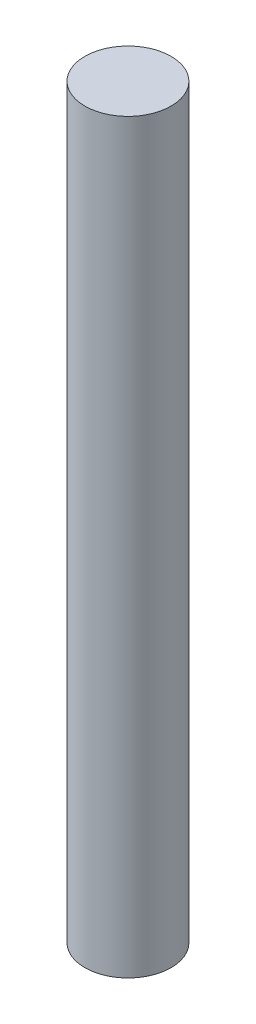
ISO-10303-21;
HEADER;
FILE_DESCRIPTION(('STEP AP214'),'2;1');
FILE_NAME('part.step','',(''),(''),'','','');
FILE_SCHEMA(('AUTOMOTIVE_DESIGN { 1 0 10303 214 1 1 1 1 }'));
ENDSEC;
DATA;
#1=APPLICATION_CONTEXT('core data for automotive mechanical design processes');
#2=APPLICATION_PROTOCOL_DEFINITION('international standard','automotive_design',2000,#1);
#3=PRODUCT_CONTEXT('',#1,'mechanical');
#4=PRODUCT('Part','Part','',(#3));
#5=PRODUCT_RELATED_PRODUCT_CATEGORY('part','',(#4));
#6=PRODUCT_DEFINITION_FORMATION('','',#4);
#7=PRODUCT_DEFINITION_CONTEXT('part definition',#1,'design');
#8=PRODUCT_DEFINITION('design','',#6,#7);
#9=PRODUCT_DEFINITION_SHAPE('','',#8);
#10=(LENGTH_UNIT() NAMED_UNIT(*) SI_UNIT(.MILLI.,.METRE.));
#11=(NAMED_UNIT(*) PLANE_ANGLE_UNIT() SI_UNIT($,.RADIAN.));
#12=(NAMED_UNIT(*) SI_UNIT($,.STERADIAN.) SOLID_ANGLE_UNIT());
#13=UNCERTAINTY_MEASURE_WITH_UNIT(LENGTH_MEASURE(1.E-05),#10,'distance_accuracy_value','');
#14=(GEOMETRIC_REPRESENTATION_CONTEXT(3) GLOBAL_UNCERTAINTY_ASSIGNED_CONTEXT((#13)) GLOBAL_UNIT_ASSIGNED_CONTEXT((#10,
#11,#12)) REPRESENTATION_CONTEXT('',''));
#15=CARTESIAN_POINT('',(0.,0.,0.));
#16=DIRECTION('',(0.,0.,1.));
#17=DIRECTION('',(1.,0.,0.));
#18=AXIS2_PLACEMENT_3D('',#15,#16,#17);
#19=CARTESIAN_POINT('',(0.,25.1,0.));
#20=DIRECTION('',(0.,-1.,0.));
#21=DIRECTION('',(0.,0.,-1.));
#22=AXIS2_PLACEMENT_3D('',#19,#20,#21);
#23=CYLINDRICAL_SURFACE('',#22,1.45);
#24=CARTESIAN_POINT('',(0.,25.1,0.));
#25=DIRECTION('',(0.,1.,0.));
#26=DIRECTION('',(0.,0.,1.));
#27=AXIS2_PLACEMENT_3D('',#24,#25,#26);
#28=CIRCLE('',#27,1.45);
#29=CARTESIAN_POINT('',(0.,25.1,1.45));
#30=VERTEX_POINT('',#29);
#31=EDGE_CURVE('E10',#30,#30,#28,.T.);
#32=ORIENTED_EDGE('',*,*,#31,.F.);
#33=EDGE_LOOP('',(#32));
#34=FACE_BOUND('',#33,.T.);
#35=CARTESIAN_POINT('',(0.,0.,0.));
#36=DIRECTION('',(0.,1.,0.));
#37=DIRECTION('',(0.,0.,1.));
#38=AXIS2_PLACEMENT_3D('',#35,#36,#37);
#39=CIRCLE('',#38,1.45);
#40=CARTESIAN_POINT('',(0.,0.,1.45));
#41=VERTEX_POINT('',#40);
#42=EDGE_CURVE('E46',#41,#41,#39,.T.);
#43=ORIENTED_EDGE('',*,*,#42,.T.);
#44=EDGE_LOOP('',(#43));
#45=FACE_BOUND('',#44,.T.);
#46=ADVANCED_FACE('F43',(#34,#45),#23,.T.);
#47=CARTESIAN_POINT('',(0.,25.1,0.));
#48=DIRECTION('',(0.,1.,0.));
#49=DIRECTION('',(0.,0.,1.));
#50=AXIS2_PLACEMENT_3D('',#47,#48,#49);
#51=PLANE('',#50);
#52=ORIENTED_EDGE('',*,*,#31,.T.);
#53=EDGE_LOOP('',(#52));
#54=FACE_BOUND('',#53,.T.);
#55=ADVANCED_FACE('F60',(#54),#51,.T.);
#56=CARTESIAN_POINT('',(0.,0.,0.));
#57=DIRECTION('',(0.,1.,0.));
#58=DIRECTION('',(0.,0.,1.));
#59=AXIS2_PLACEMENT_3D('',#56,#57,#58);
#60=PLANE('',#59);
#61=ORIENTED_EDGE('',*,*,#42,.F.);
#62=EDGE_LOOP('',(#61));
#63=FACE_BOUND('',#62,.T.);
#64=ADVANCED_FACE('F58',(#63),#60,.F.);
#65=CLOSED_SHELL('',(#46,#55,#64));
#66=MANIFOLD_SOLID_BREP('B2',#65);
#67=ADVANCED_BREP_SHAPE_REPRESENTATION('',(#18,#66),#14);
#68=SHAPE_DEFINITION_REPRESENTATION(#9,#67);
ENDSEC;
END-ISO-10303-21;
